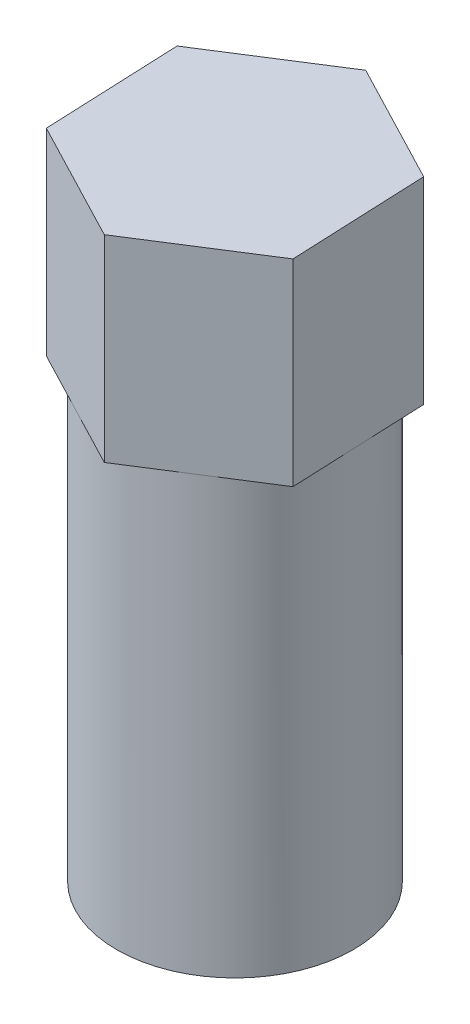
ISO-10303-21;
HEADER;
FILE_DESCRIPTION(('STEP AP214'),'2;1');
FILE_NAME('part.step','',(''),(''),'','','');
FILE_SCHEMA(('AUTOMOTIVE_DESIGN { 1 0 10303 214 1 1 1 1 }'));
ENDSEC;
DATA;
#1=APPLICATION_CONTEXT('core data for automotive mechanical design processes');
#2=APPLICATION_PROTOCOL_DEFINITION('international standard','automotive_design',2000,#1);
#3=PRODUCT_CONTEXT('',#1,'mechanical');
#4=PRODUCT('Part','Part','',(#3));
#5=PRODUCT_RELATED_PRODUCT_CATEGORY('part','',(#4));
#6=PRODUCT_DEFINITION_FORMATION('','',#4);
#7=PRODUCT_DEFINITION_CONTEXT('part definition',#1,'design');
#8=PRODUCT_DEFINITION('design','',#6,#7);
#9=PRODUCT_DEFINITION_SHAPE('','',#8);
#10=(LENGTH_UNIT() NAMED_UNIT(*) SI_UNIT(.MILLI.,.METRE.));
#11=(NAMED_UNIT(*) PLANE_ANGLE_UNIT() SI_UNIT($,.RADIAN.));
#12=(NAMED_UNIT(*) SI_UNIT($,.STERADIAN.) SOLID_ANGLE_UNIT());
#13=UNCERTAINTY_MEASURE_WITH_UNIT(LENGTH_MEASURE(1.E-05),#10,'distance_accuracy_value','');
#14=(GEOMETRIC_REPRESENTATION_CONTEXT(3) GLOBAL_UNCERTAINTY_ASSIGNED_CONTEXT((#13)) GLOBAL_UNIT_ASSIGNED_CONTEXT((#10,
#11,#12)) REPRESENTATION_CONTEXT('',''));
#15=CARTESIAN_POINT('',(0.,0.,0.));
#16=DIRECTION('',(0.,0.,1.));
#17=DIRECTION('',(1.,0.,0.));
#18=AXIS2_PLACEMENT_3D('',#15,#16,#17);
#19=CARTESIAN_POINT('',(0.,0.,0.));
#20=DIRECTION('',(0.,1.,0.));
#21=DIRECTION('',(0.,0.,1.));
#22=AXIS2_PLACEMENT_3D('',#19,#20,#21);
#23=PLANE('',#22);
#24=CARTESIAN_POINT('',(0.,0.,0.));
#25=DIRECTION('',(0.,-1.,0.));
#26=DIRECTION('',(0.,0.,-1.));
#27=AXIS2_PLACEMENT_3D('',#24,#25,#26);
#28=CIRCLE('',#27,6.);
#29=CARTESIAN_POINT('',(2.77539604017008,0.,-5.31950907699275));
#30=VERTEX_POINT('',#29);
#31=CARTESIAN_POINT('',(5.99452801642267,0.,-0.256191062146345));
#32=VERTEX_POINT('',#31);
#33=EDGE_CURVE('E52',#30,#32,#28,.T.);
#34=ORIENTED_EDGE('',*,*,#33,.F.);
#35=DIRECTION('',(-0.886584846165458,0.,-0.462566006695014));
#36=VECTOR('',#35,1.);
#37=CARTESIAN_POINT('',(5.8466160377285,0.,-3.71713342609274));
#38=LINE('',#37,#36);
#39=CARTESIAN_POINT('',(5.8466160377285,0.,-3.71713342609274));
#40=VERTEX_POINT('',#39);
#41=EDGE_CURVE('E117',#40,#30,#38,.T.);
#42=ORIENTED_EDGE('',*,*,#41,.F.);
#43=DIRECTION('',(-0.0426985103577241,0.,-0.999088002737112));
#44=VECTOR('',#43,1.);
#45=CARTESIAN_POINT('',(6.14243999511684,0.,3.20475130180004));
#46=LINE('',#45,#44);
#47=EDGE_CURVE('E134',#32,#40,#46,.T.);
#48=ORIENTED_EDGE('',*,*,#47,.F.);
#49=EDGE_LOOP('',(#34,#42,#48));
#50=FACE_BOUND('',#49,.T.);
#51=ADVANCED_FACE('F41',(#50),#23,.F.);
#52=CARTESIAN_POINT('',(3.21913197625259,0.,5.0633180148464));
#53=VERTEX_POINT('',#52);
#54=EDGE_CURVE('E11',#32,#53,#28,.T.);
#55=ORIENTED_EDGE('',*,*,#54,.F.);
#56=CARTESIAN_POINT('',(6.14243999511684,0.,3.20475130180004));
#57=VERTEX_POINT('',#56);
#58=EDGE_CURVE('E132',#57,#32,#46,.T.);
#59=ORIENTED_EDGE('',*,*,#58,.F.);
#60=DIRECTION('',(0.843886335807733,0.,-0.536521996042099));
#61=VECTOR('',#60,1.);
#62=CARTESIAN_POINT('',(0.295823957388331,0.,6.92188472789277));
#63=LINE('',#62,#61);
#64=EDGE_CURVE('E164',#53,#57,#63,.T.);
#65=ORIENTED_EDGE('',*,*,#64,.F.);
#66=EDGE_LOOP('',(#55,#59,#65));
#67=FACE_BOUND('',#66,.T.);
#68=ADVANCED_FACE('F193',(#67),#23,.F.);
#69=CARTESIAN_POINT('',(-2.77539604017009,0.,5.31950907699275));
#70=VERTEX_POINT('',#69);
#71=EDGE_CURVE('E50',#53,#70,#28,.T.);
#72=ORIENTED_EDGE('',*,*,#71,.F.);
#73=CARTESIAN_POINT('',(0.295823957388331,0.,6.92188472789277));
#74=VERTEX_POINT('',#73);
#75=EDGE_CURVE('E161',#74,#53,#63,.T.);
#76=ORIENTED_EDGE('',*,*,#75,.F.);
#77=DIRECTION('',(0.886584846165458,0.,0.462566006695014));
#78=VECTOR('',#77,1.);
#79=CARTESIAN_POINT('',(-5.84661603772851,0.,3.71713342609274));
#80=LINE('',#79,#78);
#81=EDGE_CURVE('E171',#70,#74,#80,.T.);
#82=ORIENTED_EDGE('',*,*,#81,.F.);
#83=EDGE_LOOP('',(#72,#76,#82));
#84=FACE_BOUND('',#83,.T.);
#85=ADVANCED_FACE('F200',(#84),#23,.F.);
#86=CARTESIAN_POINT('',(-5.99452801642268,0.,0.256191062146348));
#87=VERTEX_POINT('',#86);
#88=EDGE_CURVE('E142',#70,#87,#28,.T.);
#89=ORIENTED_EDGE('',*,*,#88,.F.);
#90=CARTESIAN_POINT('',(-5.84661603772851,0.,3.71713342609274));
#91=VERTEX_POINT('',#90);
#92=EDGE_CURVE('E150',#91,#70,#80,.T.);
#93=ORIENTED_EDGE('',*,*,#92,.F.);
#94=DIRECTION('',(0.0426985103577246,0.,0.999088002737112));
#95=VECTOR('',#94,1.);
#96=CARTESIAN_POINT('',(-6.14243999511685,0.,-3.20475130180004));
#97=LINE('',#96,#95);
#98=EDGE_CURVE('E167',#87,#91,#97,.T.);
#99=ORIENTED_EDGE('',*,*,#98,.F.);
#100=EDGE_LOOP('',(#89,#93,#99));
#101=FACE_BOUND('',#100,.T.);
#102=ADVANCED_FACE('F208',(#101),#23,.F.);
#103=CARTESIAN_POINT('',(-3.21913197625259,0.,-5.06331801484641));
#104=VERTEX_POINT('',#103);
#105=EDGE_CURVE('E141',#87,#104,#28,.T.);
#106=ORIENTED_EDGE('',*,*,#105,.F.);
#107=CARTESIAN_POINT('',(-6.14243999511685,0.,-3.20475130180004));
#108=VERTEX_POINT('',#107);
#109=EDGE_CURVE('E168',#108,#87,#97,.T.);
#110=ORIENTED_EDGE('',*,*,#109,.F.);
#111=DIRECTION('',(-0.843886335807734,0.,0.536521996042098));
#112=VECTOR('',#111,1.);
#113=CARTESIAN_POINT('',(-0.295823957388335,0.,-6.92188472789277));
#114=LINE('',#113,#112);
#115=EDGE_CURVE('E127',#104,#108,#114,.T.);
#116=ORIENTED_EDGE('',*,*,#115,.F.);
#117=EDGE_LOOP('',(#106,#110,#116));
#118=FACE_BOUND('',#117,.T.);
#119=ADVANCED_FACE('F214',(#118),#23,.F.);
#120=CARTESIAN_POINT('',(0.295823957388331,10.,6.92188472789277));
#121=DIRECTION('',(-0.536521996042099,0.,-0.843886335807733));
#122=DIRECTION('',(-0.843886335807733,0.,0.536521996042099));
#123=AXIS2_PLACEMENT_3D('',#120,#121,#122);
#124=PLANE('',#123);
#125=ORIENTED_EDGE('',*,*,#75,.T.);
#126=ORIENTED_EDGE('',*,*,#64,.T.);
#127=DIRECTION('',(0.,-1.,0.));
#128=VECTOR('',#127,1.);
#129=CARTESIAN_POINT('',(6.14243999511684,10.,3.20475130180004));
#130=LINE('',#129,#128);
#131=CARTESIAN_POINT('',(6.14243999511684,10.,3.20475130180004));
#132=VERTEX_POINT('',#131);
#133=EDGE_CURVE('E45',#132,#57,#130,.T.);
#134=ORIENTED_EDGE('',*,*,#133,.F.);
#135=DIRECTION('',(0.843886335807733,0.,-0.536521996042099));
#136=VECTOR('',#135,1.);
#137=CARTESIAN_POINT('',(0.295823957388331,10.,6.92188472789277));
#138=LINE('',#137,#136);
#139=CARTESIAN_POINT('',(0.295823957388331,10.,6.92188472789277));
#140=VERTEX_POINT('',#139);
#141=EDGE_CURVE('E146',#140,#132,#138,.T.);
#142=ORIENTED_EDGE('',*,*,#141,.F.);
#143=DIRECTION('',(0.,-1.,0.));
#144=VECTOR('',#143,1.);
#145=CARTESIAN_POINT('',(0.295823957388331,10.,6.92188472789277));
#146=LINE('',#145,#144);
#147=EDGE_CURVE('E160',#140,#74,#146,.T.);
#148=ORIENTED_EDGE('',*,*,#147,.T.);
#149=EDGE_LOOP('',(#125,#126,#134,#142,#148));
#150=FACE_BOUND('',#149,.T.);
#151=ADVANCED_FACE('F43',(#150),#124,.F.);
#152=CARTESIAN_POINT('',(6.14243999511684,10.,3.20475130180004));
#153=DIRECTION('',(-0.999088002737112,0.,0.0426985103577241));
#154=DIRECTION('',(0.0426985103577241,0.,0.999088002737112));
#155=AXIS2_PLACEMENT_3D('',#152,#153,#154);
#156=PLANE('',#155);
#157=ORIENTED_EDGE('',*,*,#58,.T.);
#158=ORIENTED_EDGE('',*,*,#47,.T.);
#159=DIRECTION('',(0.,-1.,0.));
#160=VECTOR('',#159,1.);
#161=CARTESIAN_POINT('',(5.8466160377285,10.,-3.71713342609274));
#162=LINE('',#161,#160);
#163=CARTESIAN_POINT('',(5.8466160377285,10.,-3.71713342609274));
#164=VERTEX_POINT('',#163);
#165=EDGE_CURVE('E124',#164,#40,#162,.T.);
#166=ORIENTED_EDGE('',*,*,#165,.F.);
#167=DIRECTION('',(-0.0426985103577241,0.,-0.999088002737112));
#168=VECTOR('',#167,1.);
#169=CARTESIAN_POINT('',(6.14243999511684,10.,3.20475130180004));
#170=LINE('',#169,#168);
#171=EDGE_CURVE('E149',#132,#164,#170,.T.);
#172=ORIENTED_EDGE('',*,*,#171,.F.);
#173=ORIENTED_EDGE('',*,*,#133,.T.);
#174=EDGE_LOOP('',(#157,#158,#166,#172,#173));
#175=FACE_BOUND('',#174,.T.);
#176=ADVANCED_FACE('F192',(#175),#156,.F.);
#177=CARTESIAN_POINT('',(5.8466160377285,10.,-3.71713342609274));
#178=DIRECTION('',(-0.462566006695014,0.,0.886584846165458));
#179=DIRECTION('',(0.886584846165458,0.,0.462566006695014));
#180=AXIS2_PLACEMENT_3D('',#177,#178,#179);
#181=PLANE('',#180);
#182=ORIENTED_EDGE('',*,*,#41,.T.);
#183=CARTESIAN_POINT('',(-0.295823957388335,0.,-6.92188472789277));
#184=VERTEX_POINT('',#183);
#185=EDGE_CURVE('E120',#30,#184,#38,.T.);
#186=ORIENTED_EDGE('',*,*,#185,.T.);
#187=DIRECTION('',(0.,-1.,0.));
#188=VECTOR('',#187,1.);
#189=CARTESIAN_POINT('',(-0.295823957388335,10.,-6.92188472789277));
#190=LINE('',#189,#188);
#191=CARTESIAN_POINT('',(-0.295823957388335,10.,-6.92188472789277));
#192=VERTEX_POINT('',#191);
#193=EDGE_CURVE('E182',#192,#184,#190,.T.);
#194=ORIENTED_EDGE('',*,*,#193,.F.);
#195=DIRECTION('',(-0.886584846165458,0.,-0.462566006695014));
#196=VECTOR('',#195,1.);
#197=CARTESIAN_POINT('',(5.8466160377285,10.,-3.71713342609274));
#198=LINE('',#197,#196);
#199=EDGE_CURVE('E152',#164,#192,#198,.T.);
#200=ORIENTED_EDGE('',*,*,#199,.F.);
#201=ORIENTED_EDGE('',*,*,#165,.T.);
#202=EDGE_LOOP('',(#182,#186,#194,#200,#201));
#203=FACE_BOUND('',#202,.T.);
#204=ADVANCED_FACE('F118',(#203),#181,.F.);
#205=CARTESIAN_POINT('',(-0.295823957388335,10.,-6.92188472789277));
#206=DIRECTION('',(0.536521996042098,0.,0.843886335807733));
#207=DIRECTION('',(0.843886335807734,0.,-0.536521996042098));
#208=AXIS2_PLACEMENT_3D('',#205,#206,#207);
#209=PLANE('',#208);
#210=EDGE_CURVE('E131',#184,#104,#114,.T.);
#211=ORIENTED_EDGE('',*,*,#210,.T.);
#212=ORIENTED_EDGE('',*,*,#115,.T.);
#213=DIRECTION('',(0.,-1.,0.));
#214=VECTOR('',#213,1.);
#215=CARTESIAN_POINT('',(-6.14243999511685,10.,-3.20475130180004));
#216=LINE('',#215,#214);
#217=CARTESIAN_POINT('',(-6.14243999511685,10.,-3.20475130180004));
#218=VERTEX_POINT('',#217);
#219=EDGE_CURVE('E179',#218,#108,#216,.T.);
#220=ORIENTED_EDGE('',*,*,#219,.F.);
#221=DIRECTION('',(-0.843886335807734,0.,0.536521996042098));
#222=VECTOR('',#221,1.);
#223=CARTESIAN_POINT('',(-0.295823957388335,10.,-6.92188472789277));
#224=LINE('',#223,#222);
#225=EDGE_CURVE('E154',#192,#218,#224,.T.);
#226=ORIENTED_EDGE('',*,*,#225,.F.);
#227=ORIENTED_EDGE('',*,*,#193,.T.);
#228=EDGE_LOOP('',(#211,#212,#220,#226,#227));
#229=FACE_BOUND('',#228,.T.);
#230=ADVANCED_FACE('F185',(#229),#209,.F.);
#231=CARTESIAN_POINT('',(-6.14243999511685,10.,-3.20475130180004));
#232=DIRECTION('',(0.999088002737112,0.,-0.0426985103577246));
#233=DIRECTION('',(-0.0426985103577246,0.,-0.999088002737112));
#234=AXIS2_PLACEMENT_3D('',#231,#232,#233);
#235=PLANE('',#234);
#236=ORIENTED_EDGE('',*,*,#109,.T.);
#237=ORIENTED_EDGE('',*,*,#98,.T.);
#238=DIRECTION('',(0.,-1.,0.));
#239=VECTOR('',#238,1.);
#240=CARTESIAN_POINT('',(-5.84661603772851,10.,3.71713342609274));
#241=LINE('',#240,#239);
#242=CARTESIAN_POINT('',(-5.84661603772851,10.,3.71713342609274));
#243=VERTEX_POINT('',#242);
#244=EDGE_CURVE('E176',#243,#91,#241,.T.);
#245=ORIENTED_EDGE('',*,*,#244,.F.);
#246=DIRECTION('',(0.0426985103577246,0.,0.999088002737112));
#247=VECTOR('',#246,1.);
#248=CARTESIAN_POINT('',(-6.14243999511685,10.,-3.20475130180004));
#249=LINE('',#248,#247);
#250=EDGE_CURVE('E156',#218,#243,#249,.T.);
#251=ORIENTED_EDGE('',*,*,#250,.F.);
#252=ORIENTED_EDGE('',*,*,#219,.T.);
#253=EDGE_LOOP('',(#236,#237,#245,#251,#252));
#254=FACE_BOUND('',#253,.T.);
#255=ADVANCED_FACE('F211',(#254),#235,.F.);
#256=CARTESIAN_POINT('',(-5.84661603772851,10.,3.71713342609274));
#257=DIRECTION('',(0.462566006695014,0.,-0.886584846165458));
#258=DIRECTION('',(-0.886584846165458,0.,-0.462566006695014));
#259=AXIS2_PLACEMENT_3D('',#256,#257,#258);
#260=PLANE('',#259);
#261=ORIENTED_EDGE('',*,*,#92,.T.);
#262=ORIENTED_EDGE('',*,*,#81,.T.);
#263=ORIENTED_EDGE('',*,*,#147,.F.);
#264=DIRECTION('',(0.886584846165458,0.,0.462566006695014));
#265=VECTOR('',#264,1.);
#266=CARTESIAN_POINT('',(-5.84661603772851,10.,3.71713342609274));
#267=LINE('',#266,#265);
#268=EDGE_CURVE('E158',#243,#140,#267,.T.);
#269=ORIENTED_EDGE('',*,*,#268,.F.);
#270=ORIENTED_EDGE('',*,*,#244,.T.);
#271=EDGE_LOOP('',(#261,#262,#263,#269,#270));
#272=FACE_BOUND('',#271,.T.);
#273=ADVANCED_FACE('F203',(#272),#260,.F.);
#274=CARTESIAN_POINT('',(0.,10.,0.));
#275=DIRECTION('',(0.,1.,0.));
#276=DIRECTION('',(0.,0.,1.));
#277=AXIS2_PLACEMENT_3D('',#274,#275,#276);
#278=PLANE('',#277);
#279=ORIENTED_EDGE('',*,*,#141,.T.);
#280=ORIENTED_EDGE('',*,*,#171,.T.);
#281=ORIENTED_EDGE('',*,*,#199,.T.);
#282=ORIENTED_EDGE('',*,*,#225,.T.);
#283=ORIENTED_EDGE('',*,*,#250,.T.);
#284=ORIENTED_EDGE('',*,*,#268,.T.);
#285=EDGE_LOOP('',(#279,#280,#281,#282,#283,#284));
#286=FACE_BOUND('',#285,.T.);
#287=ADVANCED_FACE('F188',(#286),#278,.T.);
#288=EDGE_CURVE('E65',#104,#30,#28,.T.);
#289=ORIENTED_EDGE('',*,*,#288,.F.);
#290=ORIENTED_EDGE('',*,*,#210,.F.);
#291=ORIENTED_EDGE('',*,*,#185,.F.);
#292=EDGE_LOOP('',(#289,#290,#291));
#293=FACE_BOUND('',#292,.T.);
#294=ADVANCED_FACE('F129',(#293),#23,.F.);
#295=CARTESIAN_POINT('',(0.,-22.,0.));
#296=DIRECTION('',(0.,1.,0.));
#297=DIRECTION('',(0.,0.,1.));
#298=AXIS2_PLACEMENT_3D('',#295,#296,#297);
#299=CYLINDRICAL_SURFACE('',#298,6.);
#300=CARTESIAN_POINT('',(0.,-22.,0.));
#301=DIRECTION('',(0.,-1.,0.));
#302=DIRECTION('',(0.,0.,-1.));
#303=AXIS2_PLACEMENT_3D('',#300,#301,#302);
#304=CIRCLE('',#303,6.);
#305=CARTESIAN_POINT('',(0.,-22.,-6.));
#306=VERTEX_POINT('',#305);
#307=EDGE_CURVE('E137',#306,#306,#304,.T.);
#308=ORIENTED_EDGE('',*,*,#307,.F.);
#309=EDGE_LOOP('',(#308));
#310=FACE_BOUND('',#309,.T.);
#311=ORIENTED_EDGE('',*,*,#33,.T.);
#312=ORIENTED_EDGE('',*,*,#54,.T.);
#313=ORIENTED_EDGE('',*,*,#71,.T.);
#314=ORIENTED_EDGE('',*,*,#88,.T.);
#315=ORIENTED_EDGE('',*,*,#105,.T.);
#316=ORIENTED_EDGE('',*,*,#288,.T.);
#317=EDGE_LOOP('',(#311,#312,#313,#314,#315,#316));
#318=FACE_BOUND('',#317,.T.);
#319=ADVANCED_FACE('F139',(#310,#318),#299,.T.);
#320=CARTESIAN_POINT('',(0.,-22.,0.));
#321=DIRECTION('',(0.,-1.,0.));
#322=DIRECTION('',(0.,0.,-1.));
#323=AXIS2_PLACEMENT_3D('',#320,#321,#322);
#324=PLANE('',#323);
#325=ORIENTED_EDGE('',*,*,#307,.T.);
#326=EDGE_LOOP('',(#325));
#327=FACE_BOUND('',#326,.T.);
#328=ADVANCED_FACE('F262',(#327),#324,.T.);
#329=CLOSED_SHELL('',(#51,#68,#85,#102,#119,#151,#176,#204,#230,#255,#273,#287,#294,#319,#328));
#330=MANIFOLD_SOLID_BREP('B2',#329);
#331=ADVANCED_BREP_SHAPE_REPRESENTATION('',(#18,#330),#14);
#332=SHAPE_DEFINITION_REPRESENTATION(#9,#331);
ENDSEC;
END-ISO-10303-21;
